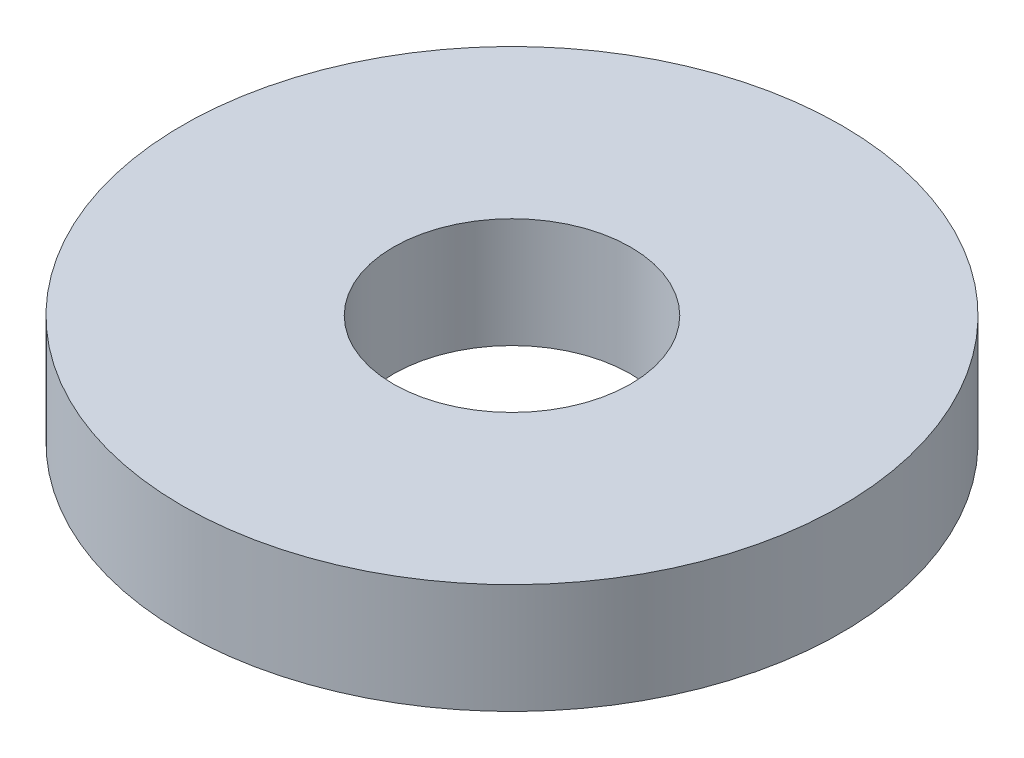
ISO-10303-21;
HEADER;
FILE_DESCRIPTION(('STEP AP214'),'2;1');
FILE_NAME('part.step','',(''),(''),'','','');
FILE_SCHEMA(('AUTOMOTIVE_DESIGN { 1 0 10303 214 1 1 1 1 }'));
ENDSEC;
DATA;
#1=APPLICATION_CONTEXT('core data for automotive mechanical design processes');
#2=APPLICATION_PROTOCOL_DEFINITION('international standard','automotive_design',2000,#1);
#3=PRODUCT_CONTEXT('',#1,'mechanical');
#4=PRODUCT('Part','Part','',(#3));
#5=PRODUCT_RELATED_PRODUCT_CATEGORY('part','',(#4));
#6=PRODUCT_DEFINITION_FORMATION('','',#4);
#7=PRODUCT_DEFINITION_CONTEXT('part definition',#1,'design');
#8=PRODUCT_DEFINITION('design','',#6,#7);
#9=PRODUCT_DEFINITION_SHAPE('','',#8);
#10=(LENGTH_UNIT() NAMED_UNIT(*) SI_UNIT(.MILLI.,.METRE.));
#11=(NAMED_UNIT(*) PLANE_ANGLE_UNIT() SI_UNIT($,.RADIAN.));
#12=(NAMED_UNIT(*) SI_UNIT($,.STERADIAN.) SOLID_ANGLE_UNIT());
#13=UNCERTAINTY_MEASURE_WITH_UNIT(LENGTH_MEASURE(1.E-05),#10,'distance_accuracy_value','');
#14=(GEOMETRIC_REPRESENTATION_CONTEXT(3) GLOBAL_UNCERTAINTY_ASSIGNED_CONTEXT((#13)) GLOBAL_UNIT_ASSIGNED_CONTEXT((#10,
#11,#12)) REPRESENTATION_CONTEXT('',''));
#15=CARTESIAN_POINT('',(0.,0.,0.));
#16=DIRECTION('',(0.,0.,1.));
#17=DIRECTION('',(1.,0.,0.));
#18=AXIS2_PLACEMENT_3D('',#15,#16,#17);
#19=CARTESIAN_POINT('',(0.,2.5,0.));
#20=DIRECTION('',(0.,1.,0.));
#21=DIRECTION('',(0.,0.,1.));
#22=AXIS2_PLACEMENT_3D('',#19,#20,#21);
#23=PLANE('',#22);
#24=CARTESIAN_POINT('',(0.,2.5,0.));
#25=DIRECTION('',(0.,1.,0.));
#26=DIRECTION('',(0.,0.,1.));
#27=AXIS2_PLACEMENT_3D('',#24,#25,#26);
#28=CIRCLE('',#27,7.5);
#29=CARTESIAN_POINT('',(0.,2.5,7.5));
#30=VERTEX_POINT('',#29);
#31=EDGE_CURVE('E10',#30,#30,#28,.T.);
#32=ORIENTED_EDGE('',*,*,#31,.T.);
#33=EDGE_LOOP('',(#32));
#34=FACE_BOUND('',#33,.T.);
#35=CARTESIAN_POINT('',(0.,2.5,0.));
#36=DIRECTION('',(0.,1.,0.));
#37=DIRECTION('',(0.,0.,1.));
#38=AXIS2_PLACEMENT_3D('',#35,#36,#37);
#39=CIRCLE('',#38,2.7);
#40=CARTESIAN_POINT('',(0.,2.5,2.7));
#41=VERTEX_POINT('',#40);
#42=EDGE_CURVE('E50',#41,#41,#39,.T.);
#43=ORIENTED_EDGE('',*,*,#42,.F.);
#44=EDGE_LOOP('',(#43));
#45=FACE_BOUND('',#44,.T.);
#46=ADVANCED_FACE('F37',(#34,#45),#23,.T.);
#47=CARTESIAN_POINT('',(0.,0.,0.));
#48=DIRECTION('',(0.,1.,0.));
#49=DIRECTION('',(0.,0.,1.));
#50=AXIS2_PLACEMENT_3D('',#47,#48,#49);
#51=PLANE('',#50);
#52=CARTESIAN_POINT('',(0.,0.,0.));
#53=DIRECTION('',(0.,1.,0.));
#54=DIRECTION('',(0.,0.,1.));
#55=AXIS2_PLACEMENT_3D('',#52,#53,#54);
#56=CIRCLE('',#55,7.5);
#57=CARTESIAN_POINT('',(0.,0.,7.5));
#58=VERTEX_POINT('',#57);
#59=EDGE_CURVE('E41',#58,#58,#56,.T.);
#60=ORIENTED_EDGE('',*,*,#59,.F.);
#61=EDGE_LOOP('',(#60));
#62=FACE_BOUND('',#61,.T.);
#63=CARTESIAN_POINT('',(0.,0.,0.));
#64=DIRECTION('',(0.,1.,0.));
#65=DIRECTION('',(0.,0.,1.));
#66=AXIS2_PLACEMENT_3D('',#63,#64,#65);
#67=CIRCLE('',#66,2.7);
#68=CARTESIAN_POINT('',(0.,0.,2.7));
#69=VERTEX_POINT('',#68);
#70=EDGE_CURVE('E52',#69,#69,#67,.T.);
#71=ORIENTED_EDGE('',*,*,#70,.T.);
#72=EDGE_LOOP('',(#71));
#73=FACE_BOUND('',#72,.T.);
#74=ADVANCED_FACE('F64',(#62,#73),#51,.F.);
#75=CARTESIAN_POINT('',(0.,2.5,0.));
#76=DIRECTION('',(0.,-1.,0.));
#77=DIRECTION('',(0.,0.,-1.));
#78=AXIS2_PLACEMENT_3D('',#75,#76,#77);
#79=CYLINDRICAL_SURFACE('',#78,7.5);
#80=ORIENTED_EDGE('',*,*,#31,.F.);
#81=EDGE_LOOP('',(#80));
#82=FACE_BOUND('',#81,.T.);
#83=ORIENTED_EDGE('',*,*,#59,.T.);
#84=EDGE_LOOP('',(#83));
#85=FACE_BOUND('',#84,.T.);
#86=ADVANCED_FACE('F39',(#82,#85),#79,.T.);
#87=CARTESIAN_POINT('',(0.,2.5,0.));
#88=DIRECTION('',(0.,-1.,0.));
#89=DIRECTION('',(0.,0.,-1.));
#90=AXIS2_PLACEMENT_3D('',#87,#88,#89);
#91=CYLINDRICAL_SURFACE('',#90,2.7);
#92=ORIENTED_EDGE('',*,*,#42,.T.);
#93=EDGE_LOOP('',(#92));
#94=FACE_BOUND('',#93,.T.);
#95=ORIENTED_EDGE('',*,*,#70,.F.);
#96=EDGE_LOOP('',(#95));
#97=FACE_BOUND('',#96,.T.);
#98=ADVANCED_FACE('F60',(#94,#97),#91,.F.);
#99=CLOSED_SHELL('',(#46,#74,#86,#98));
#100=MANIFOLD_SOLID_BREP('B2',#99);
#101=ADVANCED_BREP_SHAPE_REPRESENTATION('',(#18,#100),#14);
#102=SHAPE_DEFINITION_REPRESENTATION(#9,#101);
ENDSEC;
END-ISO-10303-21;
